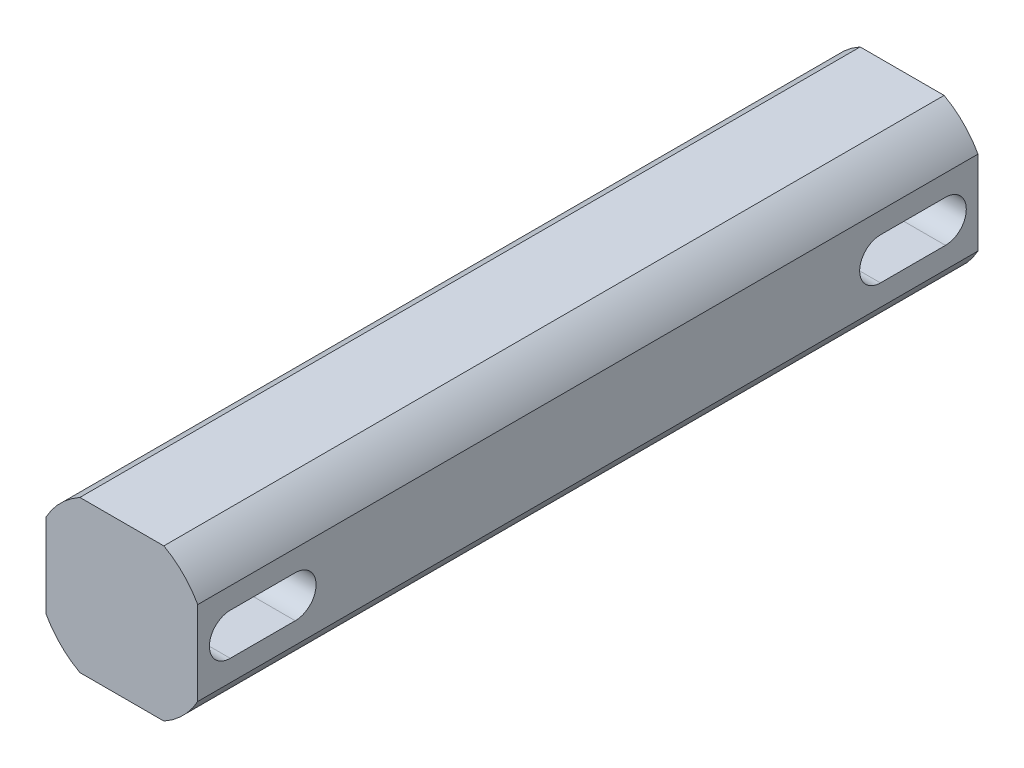
ISO-10303-21;
HEADER;
FILE_DESCRIPTION(('STEP AP214'),'2;1');
FILE_NAME('part.step','',(''),(''),'','','');
FILE_SCHEMA(('AUTOMOTIVE_DESIGN { 1 0 10303 214 1 1 1 1 }'));
ENDSEC;
DATA;
#1=APPLICATION_CONTEXT('core data for automotive mechanical design processes');
#2=APPLICATION_PROTOCOL_DEFINITION('international standard','automotive_design',2000,#1);
#3=PRODUCT_CONTEXT('',#1,'mechanical');
#4=PRODUCT('Part','Part','',(#3));
#5=PRODUCT_RELATED_PRODUCT_CATEGORY('part','',(#4));
#6=PRODUCT_DEFINITION_FORMATION('','',#4);
#7=PRODUCT_DEFINITION_CONTEXT('part definition',#1,'design');
#8=PRODUCT_DEFINITION('design','',#6,#7);
#9=PRODUCT_DEFINITION_SHAPE('','',#8);
#10=(LENGTH_UNIT() NAMED_UNIT(*) SI_UNIT(.MILLI.,.METRE.));
#11=(NAMED_UNIT(*) PLANE_ANGLE_UNIT() SI_UNIT($,.RADIAN.));
#12=(NAMED_UNIT(*) SI_UNIT($,.STERADIAN.) SOLID_ANGLE_UNIT());
#13=UNCERTAINTY_MEASURE_WITH_UNIT(LENGTH_MEASURE(1.E-05),#10,'distance_accuracy_value','');
#14=(GEOMETRIC_REPRESENTATION_CONTEXT(3) GLOBAL_UNCERTAINTY_ASSIGNED_CONTEXT((#13)) GLOBAL_UNIT_ASSIGNED_CONTEXT((#10,
#11,#12)) REPRESENTATION_CONTEXT('',''));
#15=CARTESIAN_POINT('',(0.,0.,0.));
#16=DIRECTION('',(0.,0.,1.));
#17=DIRECTION('',(1.,0.,0.));
#18=AXIS2_PLACEMENT_3D('',#15,#16,#17);
#19=CARTESIAN_POINT('',(0.,0.,28.575));
#20=DIRECTION('',(0.,0.,-1.));
#21=DIRECTION('',(-1.,0.,0.));
#22=AXIS2_PLACEMENT_3D('',#19,#20,#21);
#23=CYLINDRICAL_SURFACE('',#22,6.35);
#24=DIRECTION('',(0.,0.,-1.));
#25=VECTOR('',#24,1.);
#26=CARTESIAN_POINT('',(-3.07418053105214,-5.55625,28.575));
#27=LINE('',#26,#25);
#28=CARTESIAN_POINT('',(-3.07418053105214,-5.55625,28.575));
#29=VERTEX_POINT('',#28);
#30=CARTESIAN_POINT('',(-3.07418053105214,-5.55625,-28.575));
#31=VERTEX_POINT('',#30);
#32=EDGE_CURVE('E241',#29,#31,#27,.T.);
#33=ORIENTED_EDGE('',*,*,#32,.F.);
#34=CARTESIAN_POINT('',(0.,0.,28.575));
#35=DIRECTION('',(0.,0.,1.));
#36=DIRECTION('',(1.,0.,0.));
#37=AXIS2_PLACEMENT_3D('',#34,#35,#36);
#38=CIRCLE('',#37,6.35);
#39=CARTESIAN_POINT('',(-5.55625,-3.07418053105214,28.575));
#40=VERTEX_POINT('',#39);
#41=EDGE_CURVE('E283',#40,#29,#38,.T.);
#42=ORIENTED_EDGE('',*,*,#41,.F.);
#43=DIRECTION('',(0.,0.,-1.));
#44=VECTOR('',#43,1.);
#45=CARTESIAN_POINT('',(-5.55625,-3.07418053105214,28.575));
#46=LINE('',#45,#44);
#47=CARTESIAN_POINT('',(-5.55625,-3.07418053105214,-28.575));
#48=VERTEX_POINT('',#47);
#49=EDGE_CURVE('E227',#48,#40,#46,.F.);
#50=ORIENTED_EDGE('',*,*,#49,.F.);
#51=CARTESIAN_POINT('',(0.,0.,-28.575));
#52=DIRECTION('',(0.,0.,1.));
#53=DIRECTION('',(1.,0.,0.));
#54=AXIS2_PLACEMENT_3D('',#51,#52,#53);
#55=CIRCLE('',#54,6.35);
#56=EDGE_CURVE('E292',#48,#31,#55,.T.);
#57=ORIENTED_EDGE('',*,*,#56,.T.);
#58=EDGE_LOOP('',(#33,#42,#50,#57));
#59=FACE_BOUND('',#58,.T.);
#60=ADVANCED_FACE('F35',(#59),#23,.T.);
#61=DIRECTION('',(0.,0.,-1.));
#62=VECTOR('',#61,1.);
#63=CARTESIAN_POINT('',(3.07418053105214,-5.55625,28.575));
#64=LINE('',#63,#62);
#65=CARTESIAN_POINT('',(3.07418053105214,-5.55625,-28.575));
#66=VERTEX_POINT('',#65);
#67=CARTESIAN_POINT('',(3.07418053105214,-5.55625,28.575));
#68=VERTEX_POINT('',#67);
#69=EDGE_CURVE('E239',#66,#68,#64,.F.);
#70=ORIENTED_EDGE('',*,*,#69,.F.);
#71=CARTESIAN_POINT('',(5.55625,-3.07418053105214,-28.575));
#72=VERTEX_POINT('',#71);
#73=EDGE_CURVE('E243',#66,#72,#55,.T.);
#74=ORIENTED_EDGE('',*,*,#73,.T.);
#75=DIRECTION('',(0.,0.,-1.));
#76=VECTOR('',#75,1.);
#77=CARTESIAN_POINT('',(5.55625,-3.07418053105214,28.575));
#78=LINE('',#77,#76);
#79=CARTESIAN_POINT('',(5.55625,-3.07418053105214,28.575));
#80=VERTEX_POINT('',#79);
#81=EDGE_CURVE('E237',#80,#72,#78,.T.);
#82=ORIENTED_EDGE('',*,*,#81,.F.);
#83=EDGE_CURVE('E249',#68,#80,#38,.T.);
#84=ORIENTED_EDGE('',*,*,#83,.F.);
#85=EDGE_LOOP('',(#70,#74,#82,#84));
#86=FACE_BOUND('',#85,.T.);
#87=ADVANCED_FACE('F291',(#86),#23,.T.);
#88=DIRECTION('',(0.,0.,-1.));
#89=VECTOR('',#88,1.);
#90=CARTESIAN_POINT('',(5.55625,3.07418053105214,28.575));
#91=LINE('',#90,#89);
#92=CARTESIAN_POINT('',(5.55625,3.07418053105214,-28.575));
#93=VERTEX_POINT('',#92);
#94=CARTESIAN_POINT('',(5.55625,3.07418053105214,28.575));
#95=VERTEX_POINT('',#94);
#96=EDGE_CURVE('E235',#93,#95,#91,.F.);
#97=ORIENTED_EDGE('',*,*,#96,.F.);
#98=CARTESIAN_POINT('',(3.07418053105214,5.55625,-28.575));
#99=VERTEX_POINT('',#98);
#100=EDGE_CURVE('E250',#93,#99,#55,.T.);
#101=ORIENTED_EDGE('',*,*,#100,.T.);
#102=DIRECTION('',(0.,0.,-1.));
#103=VECTOR('',#102,1.);
#104=CARTESIAN_POINT('',(3.07418053105214,5.55625,28.575));
#105=LINE('',#104,#103);
#106=CARTESIAN_POINT('',(3.07418053105214,5.55625,28.575));
#107=VERTEX_POINT('',#106);
#108=EDGE_CURVE('E233',#107,#99,#105,.T.);
#109=ORIENTED_EDGE('',*,*,#108,.F.);
#110=EDGE_CURVE('E244',#95,#107,#38,.T.);
#111=ORIENTED_EDGE('',*,*,#110,.F.);
#112=EDGE_LOOP('',(#97,#101,#109,#111));
#113=FACE_BOUND('',#112,.T.);
#114=ADVANCED_FACE('F266',(#113),#23,.T.);
#115=DIRECTION('',(0.,0.,-1.));
#116=VECTOR('',#115,1.);
#117=CARTESIAN_POINT('',(-3.07418053105214,5.55625,28.575));
#118=LINE('',#117,#116);
#119=CARTESIAN_POINT('',(-3.07418053105214,5.55625,-28.575));
#120=VERTEX_POINT('',#119);
#121=CARTESIAN_POINT('',(-3.07418053105214,5.55625,28.575));
#122=VERTEX_POINT('',#121);
#123=EDGE_CURVE('E231',#120,#122,#118,.F.);
#124=ORIENTED_EDGE('',*,*,#123,.F.);
#125=CARTESIAN_POINT('',(-5.55625,3.07418053105214,-28.575));
#126=VERTEX_POINT('',#125);
#127=EDGE_CURVE('E253',#120,#126,#55,.T.);
#128=ORIENTED_EDGE('',*,*,#127,.T.);
#129=DIRECTION('',(0.,0.,-1.));
#130=VECTOR('',#129,1.);
#131=CARTESIAN_POINT('',(-5.55625,3.07418053105214,28.575));
#132=LINE('',#131,#130);
#133=CARTESIAN_POINT('',(-5.55625,3.07418053105214,28.575));
#134=VERTEX_POINT('',#133);
#135=EDGE_CURVE('E229',#134,#126,#132,.T.);
#136=ORIENTED_EDGE('',*,*,#135,.F.);
#137=EDGE_CURVE('E248',#122,#134,#38,.T.);
#138=ORIENTED_EDGE('',*,*,#137,.F.);
#139=EDGE_LOOP('',(#124,#128,#136,#138));
#140=FACE_BOUND('',#139,.T.);
#141=ADVANCED_FACE('F279',(#140),#23,.T.);
#142=CARTESIAN_POINT('',(0.,0.,28.575));
#143=DIRECTION('',(0.,0.,1.));
#144=DIRECTION('',(1.,0.,0.));
#145=AXIS2_PLACEMENT_3D('',#142,#143,#144);
#146=PLANE('',#145);
#147=ORIENTED_EDGE('',*,*,#41,.T.);
#148=DIRECTION('',(1.,0.,0.));
#149=VECTOR('',#148,1.);
#150=CARTESIAN_POINT('',(5.55625,-5.55625,28.575));
#151=LINE('',#150,#149);
#152=EDGE_CURVE('E218',#29,#68,#151,.T.);
#153=ORIENTED_EDGE('',*,*,#152,.T.);
#154=ORIENTED_EDGE('',*,*,#83,.T.);
#155=DIRECTION('',(0.,1.,0.));
#156=VECTOR('',#155,1.);
#157=CARTESIAN_POINT('',(5.55625,-5.55625,28.575));
#158=LINE('',#157,#156);
#159=EDGE_CURVE('E157',#80,#95,#158,.T.);
#160=ORIENTED_EDGE('',*,*,#159,.T.);
#161=ORIENTED_EDGE('',*,*,#110,.T.);
#162=DIRECTION('',(-1.,0.,0.));
#163=VECTOR('',#162,1.);
#164=CARTESIAN_POINT('',(5.55625,5.55625,28.575));
#165=LINE('',#164,#163);
#166=EDGE_CURVE('E224',#107,#122,#165,.T.);
#167=ORIENTED_EDGE('',*,*,#166,.T.);
#168=ORIENTED_EDGE('',*,*,#137,.T.);
#169=DIRECTION('',(0.,-1.,0.));
#170=VECTOR('',#169,1.);
#171=CARTESIAN_POINT('',(-5.55625,-5.55625,28.575));
#172=LINE('',#171,#170);
#173=EDGE_CURVE('E221',#134,#40,#172,.T.);
#174=ORIENTED_EDGE('',*,*,#173,.T.);
#175=EDGE_LOOP('',(#147,#153,#154,#160,#161,#167,#168,#174));
#176=FACE_BOUND('',#175,.T.);
#177=ADVANCED_FACE('F288',(#176),#146,.T.);
#178=CARTESIAN_POINT('',(0.,0.,-28.575));
#179=DIRECTION('',(0.,0.,1.));
#180=DIRECTION('',(1.,0.,0.));
#181=AXIS2_PLACEMENT_3D('',#178,#179,#180);
#182=PLANE('',#181);
#183=DIRECTION('',(1.,0.,0.));
#184=VECTOR('',#183,1.);
#185=CARTESIAN_POINT('',(0.,-5.55625,-28.575));
#186=LINE('',#185,#184);
#187=EDGE_CURVE('E12',#31,#66,#186,.T.);
#188=ORIENTED_EDGE('',*,*,#187,.F.);
#189=ORIENTED_EDGE('',*,*,#56,.F.);
#190=DIRECTION('',(0.,-1.,0.));
#191=VECTOR('',#190,1.);
#192=CARTESIAN_POINT('',(-5.55625,0.,-28.575));
#193=LINE('',#192,#191);
#194=EDGE_CURVE('E247',#126,#48,#193,.T.);
#195=ORIENTED_EDGE('',*,*,#194,.F.);
#196=ORIENTED_EDGE('',*,*,#127,.F.);
#197=DIRECTION('',(-1.,0.,0.));
#198=VECTOR('',#197,1.);
#199=CARTESIAN_POINT('',(0.,5.55625,-28.575));
#200=LINE('',#199,#198);
#201=EDGE_CURVE('E255',#99,#120,#200,.T.);
#202=ORIENTED_EDGE('',*,*,#201,.F.);
#203=ORIENTED_EDGE('',*,*,#100,.F.);
#204=DIRECTION('',(0.,1.,0.));
#205=VECTOR('',#204,1.);
#206=CARTESIAN_POINT('',(5.55625,0.,-28.575));
#207=LINE('',#206,#205);
#208=EDGE_CURVE('E42',#72,#93,#207,.T.);
#209=ORIENTED_EDGE('',*,*,#208,.F.);
#210=ORIENTED_EDGE('',*,*,#73,.F.);
#211=EDGE_LOOP('',(#188,#189,#195,#196,#202,#203,#209,#210));
#212=FACE_BOUND('',#211,.T.);
#213=ADVANCED_FACE('F270',(#212),#182,.F.);
#214=CARTESIAN_POINT('',(-5.55625,-5.55625,-46.7151173645597));
#215=DIRECTION('',(-1.,0.,0.));
#216=DIRECTION('',(0.,0.,1.));
#217=AXIS2_PLACEMENT_3D('',#214,#215,#216);
#218=PLANE('',#217);
#219=CARTESIAN_POINT('',(-5.55625,0.,-26.19375));
#220=DIRECTION('',(-1.,0.,0.));
#221=DIRECTION('',(0.,0.,1.));
#222=AXIS2_PLACEMENT_3D('',#219,#220,#221);
#223=CIRCLE('',#222,1.524);
#224=CARTESIAN_POINT('',(-5.55625,1.524,-26.19375));
#225=VERTEX_POINT('',#224);
#226=CARTESIAN_POINT('',(-5.55625,-1.524,-26.19375));
#227=VERTEX_POINT('',#226);
#228=EDGE_CURVE('E49',#225,#227,#223,.T.);
#229=ORIENTED_EDGE('',*,*,#228,.F.);
#230=DIRECTION('',(0.,0.,-1.));
#231=VECTOR('',#230,1.);
#232=CARTESIAN_POINT('',(-5.55625,1.524,-26.19375));
#233=LINE('',#232,#231);
#234=CARTESIAN_POINT('',(-5.55625,1.524,-21.43125));
#235=VERTEX_POINT('',#234);
#236=EDGE_CURVE('E163',#235,#225,#233,.T.);
#237=ORIENTED_EDGE('',*,*,#236,.F.);
#238=CARTESIAN_POINT('',(-5.55625,0.,-21.43125));
#239=DIRECTION('',(-1.,0.,0.));
#240=DIRECTION('',(0.,0.,1.));
#241=AXIS2_PLACEMENT_3D('',#238,#239,#240);
#242=CIRCLE('',#241,1.524);
#243=CARTESIAN_POINT('',(-5.55625,-1.524,-21.43125));
#244=VERTEX_POINT('',#243);
#245=EDGE_CURVE('E177',#244,#235,#242,.T.);
#246=ORIENTED_EDGE('',*,*,#245,.F.);
#247=DIRECTION('',(0.,0.,1.));
#248=VECTOR('',#247,1.);
#249=CARTESIAN_POINT('',(-5.55625,-1.524,-26.19375));
#250=LINE('',#249,#248);
#251=EDGE_CURVE('E170',#227,#244,#250,.T.);
#252=ORIENTED_EDGE('',*,*,#251,.F.);
#253=EDGE_LOOP('',(#229,#237,#246,#252));
#254=FACE_BOUND('',#253,.T.);
#255=CARTESIAN_POINT('',(-5.55625,0.,26.19375));
#256=DIRECTION('',(-1.,0.,0.));
#257=DIRECTION('',(0.,0.,-1.));
#258=AXIS2_PLACEMENT_3D('',#255,#256,#257);
#259=CIRCLE('',#258,1.524);
#260=CARTESIAN_POINT('',(-5.55625,-1.524,26.19375));
#261=VERTEX_POINT('',#260);
#262=CARTESIAN_POINT('',(-5.55625,1.524,26.19375));
#263=VERTEX_POINT('',#262);
#264=EDGE_CURVE('E57',#261,#263,#259,.T.);
#265=ORIENTED_EDGE('',*,*,#264,.F.);
#266=DIRECTION('',(0.,0.,1.));
#267=VECTOR('',#266,1.);
#268=CARTESIAN_POINT('',(-5.55625,-1.524,26.19375));
#269=LINE('',#268,#267);
#270=CARTESIAN_POINT('',(-5.55625,-1.524,21.43125));
#271=VERTEX_POINT('',#270);
#272=EDGE_CURVE('E202',#271,#261,#269,.T.);
#273=ORIENTED_EDGE('',*,*,#272,.F.);
#274=CARTESIAN_POINT('',(-5.55625,0.,21.43125));
#275=DIRECTION('',(-1.,0.,0.));
#276=DIRECTION('',(0.,0.,-1.));
#277=AXIS2_PLACEMENT_3D('',#274,#275,#276);
#278=CIRCLE('',#277,1.524);
#279=CARTESIAN_POINT('',(-5.55625,1.524,21.43125));
#280=VERTEX_POINT('',#279);
#281=EDGE_CURVE('E199',#280,#271,#278,.T.);
#282=ORIENTED_EDGE('',*,*,#281,.F.);
#283=DIRECTION('',(0.,0.,-1.));
#284=VECTOR('',#283,1.);
#285=CARTESIAN_POINT('',(-5.55625,1.524,26.19375));
#286=LINE('',#285,#284);
#287=EDGE_CURVE('E196',#263,#280,#286,.T.);
#288=ORIENTED_EDGE('',*,*,#287,.F.);
#289=EDGE_LOOP('',(#265,#273,#282,#288));
#290=FACE_BOUND('',#289,.T.);
#291=ORIENTED_EDGE('',*,*,#135,.T.);
#292=ORIENTED_EDGE('',*,*,#194,.T.);
#293=ORIENTED_EDGE('',*,*,#49,.T.);
#294=ORIENTED_EDGE('',*,*,#173,.F.);
#295=EDGE_LOOP('',(#291,#292,#293,#294));
#296=FACE_BOUND('',#295,.T.);
#297=ADVANCED_FACE('F336',(#254,#290,#296),#218,.T.);
#298=CARTESIAN_POINT('',(5.55625,5.55625,-46.7151173645597));
#299=DIRECTION('',(0.,1.,0.));
#300=DIRECTION('',(-1.,0.,0.));
#301=AXIS2_PLACEMENT_3D('',#298,#299,#300);
#302=PLANE('',#301);
#303=ORIENTED_EDGE('',*,*,#108,.T.);
#304=ORIENTED_EDGE('',*,*,#201,.T.);
#305=ORIENTED_EDGE('',*,*,#123,.T.);
#306=ORIENTED_EDGE('',*,*,#166,.F.);
#307=EDGE_LOOP('',(#303,#304,#305,#306));
#308=FACE_BOUND('',#307,.T.);
#309=ADVANCED_FACE('F276',(#308),#302,.T.);
#310=CARTESIAN_POINT('',(5.55625,-5.55625,-46.7151173645597));
#311=DIRECTION('',(1.,0.,0.));
#312=DIRECTION('',(0.,0.,-1.));
#313=AXIS2_PLACEMENT_3D('',#310,#311,#312);
#314=PLANE('',#313);
#315=CARTESIAN_POINT('',(5.55625,0.,-26.19375));
#316=DIRECTION('',(1.,0.,0.));
#317=DIRECTION('',(0.,0.,-1.));
#318=AXIS2_PLACEMENT_3D('',#315,#316,#317);
#319=CIRCLE('',#318,1.524);
#320=CARTESIAN_POINT('',(5.55625,1.524,-26.19375));
#321=VERTEX_POINT('',#320);
#322=CARTESIAN_POINT('',(5.55625,-1.524,-26.19375));
#323=VERTEX_POINT('',#322);
#324=EDGE_CURVE('E161',#321,#323,#319,.F.);
#325=ORIENTED_EDGE('',*,*,#324,.T.);
#326=DIRECTION('',(0.,0.,1.));
#327=VECTOR('',#326,1.);
#328=CARTESIAN_POINT('',(5.55625,-1.524,-26.19375));
#329=LINE('',#328,#327);
#330=CARTESIAN_POINT('',(5.55625,-1.524,-21.43125));
#331=VERTEX_POINT('',#330);
#332=EDGE_CURVE('E147',#323,#331,#329,.T.);
#333=ORIENTED_EDGE('',*,*,#332,.T.);
#334=CARTESIAN_POINT('',(5.55625,0.,-21.43125));
#335=DIRECTION('',(1.,0.,0.));
#336=DIRECTION('',(0.,0.,-1.));
#337=AXIS2_PLACEMENT_3D('',#334,#335,#336);
#338=CIRCLE('',#337,1.524);
#339=CARTESIAN_POINT('',(5.55625,1.524,-21.43125));
#340=VERTEX_POINT('',#339);
#341=EDGE_CURVE('E172',#331,#340,#338,.F.);
#342=ORIENTED_EDGE('',*,*,#341,.T.);
#343=DIRECTION('',(0.,0.,-1.));
#344=VECTOR('',#343,1.);
#345=CARTESIAN_POINT('',(5.55625,1.524,-26.19375));
#346=LINE('',#345,#344);
#347=EDGE_CURVE('E168',#340,#321,#346,.T.);
#348=ORIENTED_EDGE('',*,*,#347,.T.);
#349=EDGE_LOOP('',(#325,#333,#342,#348));
#350=FACE_BOUND('',#349,.T.);
#351=CARTESIAN_POINT('',(5.55625,0.,26.19375));
#352=DIRECTION('',(1.,0.,0.));
#353=DIRECTION('',(0.,0.,-1.));
#354=AXIS2_PLACEMENT_3D('',#351,#352,#353);
#355=CIRCLE('',#354,1.524);
#356=CARTESIAN_POINT('',(5.55625,-1.524,26.19375));
#357=VERTEX_POINT('',#356);
#358=CARTESIAN_POINT('',(5.55625,1.524,26.19375));
#359=VERTEX_POINT('',#358);
#360=EDGE_CURVE('E192',#357,#359,#355,.F.);
#361=ORIENTED_EDGE('',*,*,#360,.T.);
#362=DIRECTION('',(0.,0.,-1.));
#363=VECTOR('',#362,1.);
#364=CARTESIAN_POINT('',(5.55625,1.524,26.19375));
#365=LINE('',#364,#363);
#366=CARTESIAN_POINT('',(5.55625,1.524,21.43125));
#367=VERTEX_POINT('',#366);
#368=EDGE_CURVE('E208',#359,#367,#365,.T.);
#369=ORIENTED_EDGE('',*,*,#368,.T.);
#370=CARTESIAN_POINT('',(5.55625,0.,21.43125));
#371=DIRECTION('',(1.,0.,0.));
#372=DIRECTION('',(0.,0.,-1.));
#373=AXIS2_PLACEMENT_3D('',#370,#371,#372);
#374=CIRCLE('',#373,1.524);
#375=CARTESIAN_POINT('',(5.55625,-1.524,21.43125));
#376=VERTEX_POINT('',#375);
#377=EDGE_CURVE('E186',#367,#376,#374,.F.);
#378=ORIENTED_EDGE('',*,*,#377,.T.);
#379=DIRECTION('',(0.,0.,1.));
#380=VECTOR('',#379,1.);
#381=CARTESIAN_POINT('',(5.55625,-1.524,26.19375));
#382=LINE('',#381,#380);
#383=EDGE_CURVE('E189',#376,#357,#382,.T.);
#384=ORIENTED_EDGE('',*,*,#383,.T.);
#385=EDGE_LOOP('',(#361,#369,#378,#384));
#386=FACE_BOUND('',#385,.T.);
#387=ORIENTED_EDGE('',*,*,#81,.T.);
#388=ORIENTED_EDGE('',*,*,#208,.T.);
#389=ORIENTED_EDGE('',*,*,#96,.T.);
#390=ORIENTED_EDGE('',*,*,#159,.F.);
#391=EDGE_LOOP('',(#387,#388,#389,#390));
#392=FACE_BOUND('',#391,.T.);
#393=ADVANCED_FACE('F166',(#350,#386,#392),#314,.T.);
#394=CARTESIAN_POINT('',(5.55625,-5.55625,-46.7151173645597));
#395=DIRECTION('',(0.,-1.,0.));
#396=DIRECTION('',(1.,0.,0.));
#397=AXIS2_PLACEMENT_3D('',#394,#395,#396);
#398=PLANE('',#397);
#399=ORIENTED_EDGE('',*,*,#32,.T.);
#400=ORIENTED_EDGE('',*,*,#187,.T.);
#401=ORIENTED_EDGE('',*,*,#69,.T.);
#402=ORIENTED_EDGE('',*,*,#152,.F.);
#403=EDGE_LOOP('',(#399,#400,#401,#402));
#404=FACE_BOUND('',#403,.T.);
#405=ADVANCED_FACE('F299',(#404),#398,.T.);
#406=CARTESIAN_POINT('',(5.55725,0.,26.19375));
#407=DIRECTION('',(-1.,0.,0.));
#408=DIRECTION('',(0.,0.,1.));
#409=AXIS2_PLACEMENT_3D('',#406,#407,#408);
#410=CYLINDRICAL_SURFACE('',#409,1.524);
#411=DIRECTION('',(-1.,0.,0.));
#412=VECTOR('',#411,1.);
#413=CARTESIAN_POINT('',(5.55725,-1.524,26.19375));
#414=LINE('',#413,#412);
#415=EDGE_CURVE('E206',#357,#261,#414,.T.);
#416=ORIENTED_EDGE('',*,*,#415,.T.);
#417=ORIENTED_EDGE('',*,*,#264,.T.);
#418=DIRECTION('',(-1.,0.,0.));
#419=VECTOR('',#418,1.);
#420=CARTESIAN_POINT('',(5.55725,1.524,26.19375));
#421=LINE('',#420,#419);
#422=EDGE_CURVE('E205',#359,#263,#421,.T.);
#423=ORIENTED_EDGE('',*,*,#422,.F.);
#424=ORIENTED_EDGE('',*,*,#360,.F.);
#425=EDGE_LOOP('',(#416,#417,#423,#424));
#426=FACE_BOUND('',#425,.T.);
#427=ADVANCED_FACE('F301',(#426),#410,.F.);
#428=CARTESIAN_POINT('',(5.55725,-1.524,26.19375));
#429=DIRECTION('',(0.,-1.,0.));
#430=DIRECTION('',(0.,0.,-1.));
#431=AXIS2_PLACEMENT_3D('',#428,#429,#430);
#432=PLANE('',#431);
#433=DIRECTION('',(-1.,0.,0.));
#434=VECTOR('',#433,1.);
#435=CARTESIAN_POINT('',(5.55725,-1.524,21.43125));
#436=LINE('',#435,#434);
#437=EDGE_CURVE('E209',#376,#271,#436,.T.);
#438=ORIENTED_EDGE('',*,*,#437,.T.);
#439=ORIENTED_EDGE('',*,*,#272,.T.);
#440=ORIENTED_EDGE('',*,*,#415,.F.);
#441=ORIENTED_EDGE('',*,*,#383,.F.);
#442=EDGE_LOOP('',(#438,#439,#440,#441));
#443=FACE_BOUND('',#442,.T.);
#444=ADVANCED_FACE('F307',(#443),#432,.F.);
#445=CARTESIAN_POINT('',(5.55725,0.,21.43125));
#446=DIRECTION('',(-1.,0.,0.));
#447=DIRECTION('',(0.,0.,1.));
#448=AXIS2_PLACEMENT_3D('',#445,#446,#447);
#449=CYLINDRICAL_SURFACE('',#448,1.524);
#450=DIRECTION('',(-1.,0.,0.));
#451=VECTOR('',#450,1.);
#452=CARTESIAN_POINT('',(5.55725,1.524,21.43125));
#453=LINE('',#452,#451);
#454=EDGE_CURVE('E211',#367,#280,#453,.T.);
#455=ORIENTED_EDGE('',*,*,#454,.T.);
#456=ORIENTED_EDGE('',*,*,#281,.T.);
#457=ORIENTED_EDGE('',*,*,#437,.F.);
#458=ORIENTED_EDGE('',*,*,#377,.F.);
#459=EDGE_LOOP('',(#455,#456,#457,#458));
#460=FACE_BOUND('',#459,.T.);
#461=ADVANCED_FACE('F371',(#460),#449,.F.);
#462=CARTESIAN_POINT('',(5.55725,1.524,26.19375));
#463=DIRECTION('',(0.,1.,0.));
#464=DIRECTION('',(0.,0.,1.));
#465=AXIS2_PLACEMENT_3D('',#462,#463,#464);
#466=PLANE('',#465);
#467=ORIENTED_EDGE('',*,*,#422,.T.);
#468=ORIENTED_EDGE('',*,*,#287,.T.);
#469=ORIENTED_EDGE('',*,*,#454,.F.);
#470=ORIENTED_EDGE('',*,*,#368,.F.);
#471=EDGE_LOOP('',(#467,#468,#469,#470));
#472=FACE_BOUND('',#471,.T.);
#473=ADVANCED_FACE('F380',(#472),#466,.F.);
#474=CARTESIAN_POINT('',(5.55725,0.,-26.19375));
#475=DIRECTION('',(-1.,0.,0.));
#476=DIRECTION('',(0.,0.,1.));
#477=AXIS2_PLACEMENT_3D('',#474,#475,#476);
#478=CYLINDRICAL_SURFACE('',#477,1.524);
#479=DIRECTION('',(-1.,0.,0.));
#480=VECTOR('',#479,1.);
#481=CARTESIAN_POINT('',(5.55725,1.524,-26.19375));
#482=LINE('',#481,#480);
#483=EDGE_CURVE('E158',#321,#225,#482,.T.);
#484=ORIENTED_EDGE('',*,*,#483,.T.);
#485=ORIENTED_EDGE('',*,*,#228,.T.);
#486=DIRECTION('',(-1.,0.,0.));
#487=VECTOR('',#486,1.);
#488=CARTESIAN_POINT('',(5.55725,-1.524,-26.19375));
#489=LINE('',#488,#487);
#490=EDGE_CURVE('E150',#323,#227,#489,.T.);
#491=ORIENTED_EDGE('',*,*,#490,.F.);
#492=ORIENTED_EDGE('',*,*,#324,.F.);
#493=EDGE_LOOP('',(#484,#485,#491,#492));
#494=FACE_BOUND('',#493,.T.);
#495=ADVANCED_FACE('F160',(#494),#478,.F.);
#496=CARTESIAN_POINT('',(5.55725,1.524,-26.19375));
#497=DIRECTION('',(0.,1.,0.));
#498=DIRECTION('',(0.,0.,1.));
#499=AXIS2_PLACEMENT_3D('',#496,#497,#498);
#500=PLANE('',#499);
#501=DIRECTION('',(-1.,0.,0.));
#502=VECTOR('',#501,1.);
#503=CARTESIAN_POINT('',(5.55725,1.524,-21.43125));
#504=LINE('',#503,#502);
#505=EDGE_CURVE('E183',#340,#235,#504,.T.);
#506=ORIENTED_EDGE('',*,*,#505,.T.);
#507=ORIENTED_EDGE('',*,*,#236,.T.);
#508=ORIENTED_EDGE('',*,*,#483,.F.);
#509=ORIENTED_EDGE('',*,*,#347,.F.);
#510=EDGE_LOOP('',(#506,#507,#508,#509));
#511=FACE_BOUND('',#510,.T.);
#512=ADVANCED_FACE('F397',(#511),#500,.F.);
#513=CARTESIAN_POINT('',(5.55725,0.,-21.43125));
#514=DIRECTION('',(-1.,0.,0.));
#515=DIRECTION('',(0.,0.,1.));
#516=AXIS2_PLACEMENT_3D('',#513,#514,#515);
#517=CYLINDRICAL_SURFACE('',#516,1.524);
#518=DIRECTION('',(-1.,0.,0.));
#519=VECTOR('',#518,1.);
#520=CARTESIAN_POINT('',(5.55725,-1.524,-21.43125));
#521=LINE('',#520,#519);
#522=EDGE_CURVE('E152',#331,#244,#521,.T.);
#523=ORIENTED_EDGE('',*,*,#522,.T.);
#524=ORIENTED_EDGE('',*,*,#245,.T.);
#525=ORIENTED_EDGE('',*,*,#505,.F.);
#526=ORIENTED_EDGE('',*,*,#341,.F.);
#527=EDGE_LOOP('',(#523,#524,#525,#526));
#528=FACE_BOUND('',#527,.T.);
#529=ADVANCED_FACE('F405',(#528),#517,.F.);
#530=CARTESIAN_POINT('',(5.55725,-1.524,-26.19375));
#531=DIRECTION('',(0.,-1.,0.));
#532=DIRECTION('',(0.,0.,-1.));
#533=AXIS2_PLACEMENT_3D('',#530,#531,#532);
#534=PLANE('',#533);
#535=ORIENTED_EDGE('',*,*,#490,.T.);
#536=ORIENTED_EDGE('',*,*,#251,.T.);
#537=ORIENTED_EDGE('',*,*,#522,.F.);
#538=ORIENTED_EDGE('',*,*,#332,.F.);
#539=EDGE_LOOP('',(#535,#536,#537,#538));
#540=FACE_BOUND('',#539,.T.);
#541=ADVANCED_FACE('F148',(#540),#534,.F.);
#542=CLOSED_SHELL('',(#60,#87,#114,#141,#177,#213,#297,#309,#393,#405,#427,#444,#461,#473,#495,
#512,#529,#541));
#543=MANIFOLD_SOLID_BREP('B2',#542);
#544=ADVANCED_BREP_SHAPE_REPRESENTATION('',(#18,#543),#14);
#545=SHAPE_DEFINITION_REPRESENTATION(#9,#544);
ENDSEC;
END-ISO-10303-21;
